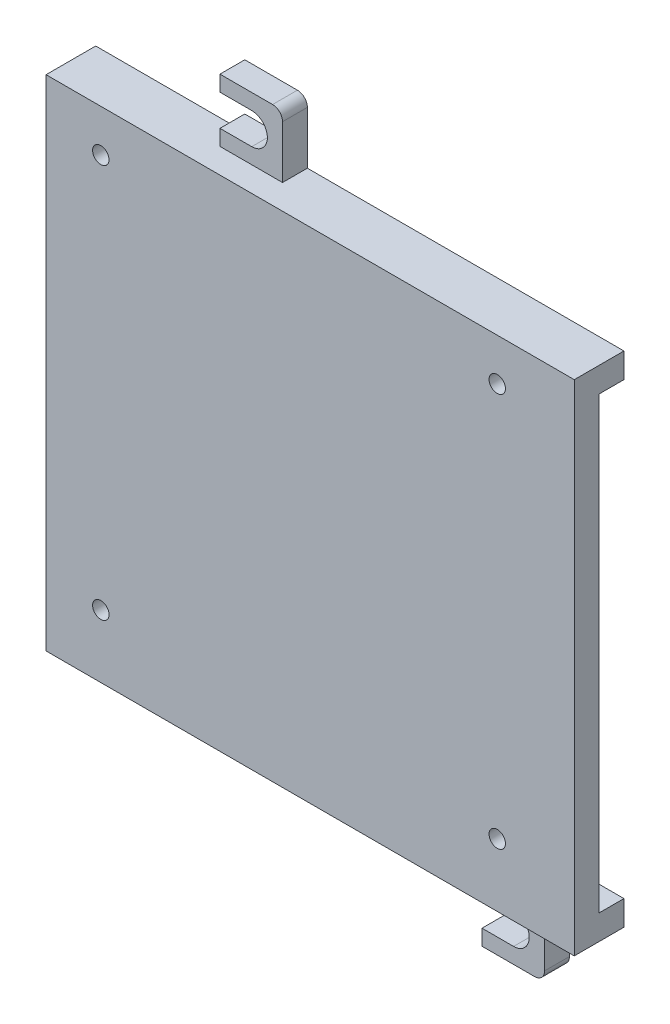
ISO-10303-21;
HEADER;
FILE_DESCRIPTION(('STEP AP214'),'2;1');
FILE_NAME('part.step','',(''),(''),'','','');
FILE_SCHEMA(('AUTOMOTIVE_DESIGN { 1 0 10303 214 1 1 1 1 }'));
ENDSEC;
DATA;
#1=APPLICATION_CONTEXT('core data for automotive mechanical design processes');
#2=APPLICATION_PROTOCOL_DEFINITION('international standard','automotive_design',2000,#1);
#3=PRODUCT_CONTEXT('',#1,'mechanical');
#4=PRODUCT('Part','Part','',(#3));
#5=PRODUCT_RELATED_PRODUCT_CATEGORY('part','',(#4));
#6=PRODUCT_DEFINITION_FORMATION('','',#4);
#7=PRODUCT_DEFINITION_CONTEXT('part definition',#1,'design');
#8=PRODUCT_DEFINITION('design','',#6,#7);
#9=PRODUCT_DEFINITION_SHAPE('','',#8);
#10=(LENGTH_UNIT() NAMED_UNIT(*) SI_UNIT(.MILLI.,.METRE.));
#11=(NAMED_UNIT(*) PLANE_ANGLE_UNIT() SI_UNIT($,.RADIAN.));
#12=(NAMED_UNIT(*) SI_UNIT($,.STERADIAN.) SOLID_ANGLE_UNIT());
#13=UNCERTAINTY_MEASURE_WITH_UNIT(LENGTH_MEASURE(1.E-05),#10,'distance_accuracy_value','');
#14=(GEOMETRIC_REPRESENTATION_CONTEXT(3) GLOBAL_UNCERTAINTY_ASSIGNED_CONTEXT((#13)) GLOBAL_UNIT_ASSIGNED_CONTEXT((#10,
#11,#12)) REPRESENTATION_CONTEXT('',''));
#15=CARTESIAN_POINT('',(0.,0.,0.));
#16=DIRECTION('',(0.,0.,1.));
#17=DIRECTION('',(1.,0.,0.));
#18=AXIS2_PLACEMENT_3D('',#15,#16,#17);
#19=CARTESIAN_POINT('',(0.,-11.5232891046381,-64.8744476194032));
#20=DIRECTION('',(0.,-1.,0.));
#21=DIRECTION('',(0.,0.,-1.));
#22=AXIS2_PLACEMENT_3D('',#19,#20,#21);
#23=PLANE('',#22);
#24=DIRECTION('',(0.,0.,-1.));
#25=VECTOR('',#24,1.);
#26=CARTESIAN_POINT('',(118.238104548264,-11.5232891046381,-71.2244476194032));
#27=LINE('',#26,#25);
#28=CARTESIAN_POINT('',(118.238104548264,-11.5232891046381,-71.2244476194032));
#29=VERTEX_POINT('',#28);
#30=CARTESIAN_POINT('',(118.238104548264,-11.5232891046381,-77.5744476194032));
#31=VERTEX_POINT('',#30);
#32=EDGE_CURVE('E324',#29,#31,#27,.T.);
#33=ORIENTED_EDGE('',*,*,#32,.F.);
#34=DIRECTION('',(-1.,0.,0.));
#35=VECTOR('',#34,1.);
#36=CARTESIAN_POINT('',(0.,-11.5232891046381,-71.2244476194032));
#37=LINE('',#36,#35);
#38=CARTESIAN_POINT('',(102.238104548264,-11.5232891046381,-71.2244476194032));
#39=VERTEX_POINT('',#38);
#40=EDGE_CURVE('E293',#29,#39,#37,.T.);
#41=ORIENTED_EDGE('',*,*,#40,.T.);
#42=DIRECTION('',(0.,0.,-1.));
#43=VECTOR('',#42,1.);
#44=CARTESIAN_POINT('',(102.238104548264,-11.5232891046381,-71.2244476194032));
#45=LINE('',#44,#43);
#46=CARTESIAN_POINT('',(102.238104548264,-11.5232891046381,-77.5744476194032));
#47=VERTEX_POINT('',#46);
#48=EDGE_CURVE('E321',#39,#47,#45,.T.);
#49=ORIENTED_EDGE('',*,*,#48,.T.);
#50=DIRECTION('',(-1.,0.,0.));
#51=VECTOR('',#50,1.);
#52=CARTESIAN_POINT('',(0.,-11.5232891046381,-77.5744476194032));
#53=LINE('',#52,#51);
#54=CARTESIAN_POINT('',(64.1381045482638,-11.5232891046381,-77.5744476194032));
#55=VERTEX_POINT('',#54);
#56=EDGE_CURVE('E334',#47,#55,#53,.T.);
#57=ORIENTED_EDGE('',*,*,#56,.T.);
#58=DIRECTION('',(0.,0.,-1.));
#59=VECTOR('',#58,1.);
#60=CARTESIAN_POINT('',(64.1381045482638,-11.5232891046381,-64.8744476194032));
#61=LINE('',#60,#59);
#62=CARTESIAN_POINT('',(64.1381045482638,-11.5232891046381,-64.8744476194032));
#63=VERTEX_POINT('',#62);
#64=EDGE_CURVE('E347',#63,#55,#61,.T.);
#65=ORIENTED_EDGE('',*,*,#64,.F.);
#66=DIRECTION('',(-1.,0.,0.));
#67=VECTOR('',#66,1.);
#68=CARTESIAN_POINT('',(0.,-11.5232891046381,-64.8744476194032));
#69=LINE('',#68,#67);
#70=CARTESIAN_POINT('',(199.169520932819,-11.5232891046381,-64.8744476194032));
#71=VERTEX_POINT('',#70);
#72=EDGE_CURVE('E344',#71,#63,#69,.T.);
#73=ORIENTED_EDGE('',*,*,#72,.F.);
#74=DIRECTION('',(0.,0.,-1.));
#75=VECTOR('',#74,1.);
#76=CARTESIAN_POINT('',(199.169520932819,-11.5232891046381,-64.8744476194032));
#77=LINE('',#76,#75);
#78=CARTESIAN_POINT('',(199.169520932819,-11.5232891046381,-77.5744476194032));
#79=VERTEX_POINT('',#78);
#80=EDGE_CURVE('E353',#71,#79,#77,.T.);
#81=ORIENTED_EDGE('',*,*,#80,.T.);
#82=EDGE_CURVE('E335',#79,#31,#53,.T.);
#83=ORIENTED_EDGE('',*,*,#82,.T.);
#84=EDGE_LOOP('',(#33,#41,#49,#57,#65,#73,#81,#83));
#85=FACE_BOUND('',#84,.T.);
#86=ADVANCED_FACE('F43',(#85),#23,.F.);
#87=CARTESIAN_POINT('',(64.1381045482638,0.,-71.2244476194032));
#88=DIRECTION('',(-1.,0.,0.));
#89=DIRECTION('',(0.,0.,1.));
#90=AXIS2_PLACEMENT_3D('',#87,#88,#89);
#91=PLANE('',#90);
#92=DIRECTION('',(0.,-1.,0.));
#93=VECTOR('',#92,1.);
#94=CARTESIAN_POINT('',(64.1381045482638,0.,-64.8744476194032));
#95=LINE('',#94,#93);
#96=CARTESIAN_POINT('',(64.1381045482638,-139.102289104638,-64.8744476194032));
#97=VERTEX_POINT('',#96);
#98=EDGE_CURVE('E419',#63,#97,#95,.T.);
#99=ORIENTED_EDGE('',*,*,#98,.F.);
#100=ORIENTED_EDGE('',*,*,#64,.T.);
#101=DIRECTION('',(0.,-1.,0.));
#102=VECTOR('',#101,1.);
#103=CARTESIAN_POINT('',(64.1381045482638,0.,-77.5744476194032));
#104=LINE('',#103,#102);
#105=CARTESIAN_POINT('',(64.1381045482638,-17.8732891046381,-77.5744476194032));
#106=VERTEX_POINT('',#105);
#107=EDGE_CURVE('E317',#55,#106,#104,.T.);
#108=ORIENTED_EDGE('',*,*,#107,.T.);
#109=DIRECTION('',(0.,0.,-1.));
#110=VECTOR('',#109,1.);
#111=CARTESIAN_POINT('',(64.1381045482638,-17.8732891046381,-64.8744476194032));
#112=LINE('',#111,#110);
#113=CARTESIAN_POINT('',(64.1381045482638,-17.8732891046381,-71.2244476194032));
#114=VERTEX_POINT('',#113);
#115=EDGE_CURVE('E348',#114,#106,#112,.T.);
#116=ORIENTED_EDGE('',*,*,#115,.F.);
#117=DIRECTION('',(0.,-1.,0.));
#118=VECTOR('',#117,1.);
#119=CARTESIAN_POINT('',(64.1381045482638,0.,-71.2244476194032));
#120=LINE('',#119,#118);
#121=CARTESIAN_POINT('',(64.1381045482638,-132.752289104638,-71.2244476194032));
#122=VERTEX_POINT('',#121);
#123=EDGE_CURVE('E395',#114,#122,#120,.T.);
#124=ORIENTED_EDGE('',*,*,#123,.T.);
#125=DIRECTION('',(0.,0.,-1.));
#126=VECTOR('',#125,1.);
#127=CARTESIAN_POINT('',(64.1381045482638,-132.752289104638,-64.8744476194032));
#128=LINE('',#127,#126);
#129=CARTESIAN_POINT('',(64.1381045482638,-132.752289104638,-77.5744476194032));
#130=VERTEX_POINT('',#129);
#131=EDGE_CURVE('E378',#122,#130,#128,.T.);
#132=ORIENTED_EDGE('',*,*,#131,.T.);
#133=DIRECTION('',(0.,1.,0.));
#134=VECTOR('',#133,1.);
#135=CARTESIAN_POINT('',(64.1381045482638,0.,-77.5744476194032));
#136=LINE('',#135,#134);
#137=CARTESIAN_POINT('',(64.1381045482638,-139.102289104638,-77.5744476194032));
#138=VERTEX_POINT('',#137);
#139=EDGE_CURVE('E360',#138,#130,#136,.T.);
#140=ORIENTED_EDGE('',*,*,#139,.F.);
#141=DIRECTION('',(0.,0.,-1.));
#142=VECTOR('',#141,1.);
#143=CARTESIAN_POINT('',(64.1381045482638,-139.102289104638,-64.8744476194032));
#144=LINE('',#143,#142);
#145=EDGE_CURVE('E372',#97,#138,#144,.T.);
#146=ORIENTED_EDGE('',*,*,#145,.F.);
#147=EDGE_LOOP('',(#99,#100,#108,#116,#124,#132,#140,#146));
#148=FACE_BOUND('',#147,.T.);
#149=ADVANCED_FACE('F458',(#148),#91,.T.);
#150=CARTESIAN_POINT('',(199.169520932819,0.,-71.2244476194032));
#151=DIRECTION('',(-1.,0.,0.));
#152=DIRECTION('',(0.,0.,1.));
#153=AXIS2_PLACEMENT_3D('',#150,#151,#152);
#154=PLANE('',#153);
#155=DIRECTION('',(0.,-1.,0.));
#156=VECTOR('',#155,1.);
#157=CARTESIAN_POINT('',(199.169520932819,0.,-64.8744476194032));
#158=LINE('',#157,#156);
#159=CARTESIAN_POINT('',(199.169520932819,-139.102289104638,-64.8744476194032));
#160=VERTEX_POINT('',#159);
#161=EDGE_CURVE('E386',#71,#160,#158,.T.);
#162=ORIENTED_EDGE('',*,*,#161,.T.);
#163=DIRECTION('',(0.,0.,-1.));
#164=VECTOR('',#163,1.);
#165=CARTESIAN_POINT('',(199.169520932819,-139.102289104638,-64.8744476194032));
#166=LINE('',#165,#164);
#167=CARTESIAN_POINT('',(199.169520932819,-139.102289104638,-77.5744476194032));
#168=VERTEX_POINT('',#167);
#169=EDGE_CURVE('E373',#160,#168,#166,.T.);
#170=ORIENTED_EDGE('',*,*,#169,.T.);
#171=DIRECTION('',(0.,-1.,0.));
#172=VECTOR('',#171,1.);
#173=CARTESIAN_POINT('',(199.169520932819,0.,-77.5744476194032));
#174=LINE('',#173,#172);
#175=CARTESIAN_POINT('',(199.169520932819,-132.752289104638,-77.5744476194032));
#176=VERTEX_POINT('',#175);
#177=EDGE_CURVE('E366',#176,#168,#174,.T.);
#178=ORIENTED_EDGE('',*,*,#177,.F.);
#179=DIRECTION('',(0.,0.,-1.));
#180=VECTOR('',#179,1.);
#181=CARTESIAN_POINT('',(199.169520932819,-132.752289104638,-64.8744476194032));
#182=LINE('',#181,#180);
#183=CARTESIAN_POINT('',(199.169520932819,-132.752289104638,-71.2244476194032));
#184=VERTEX_POINT('',#183);
#185=EDGE_CURVE('E376',#184,#176,#182,.T.);
#186=ORIENTED_EDGE('',*,*,#185,.F.);
#187=DIRECTION('',(0.,-1.,0.));
#188=VECTOR('',#187,1.);
#189=CARTESIAN_POINT('',(199.169520932819,0.,-71.2244476194032));
#190=LINE('',#189,#188);
#191=CARTESIAN_POINT('',(199.169520932819,-17.8732891046381,-71.2244476194032));
#192=VERTEX_POINT('',#191);
#193=EDGE_CURVE('E401',#192,#184,#190,.T.);
#194=ORIENTED_EDGE('',*,*,#193,.F.);
#195=DIRECTION('',(0.,0.,-1.));
#196=VECTOR('',#195,1.);
#197=CARTESIAN_POINT('',(199.169520932819,-17.8732891046381,-64.8744476194032));
#198=LINE('',#197,#196);
#199=CARTESIAN_POINT('',(199.169520932819,-17.8732891046381,-77.5744476194032));
#200=VERTEX_POINT('',#199);
#201=EDGE_CURVE('E351',#192,#200,#198,.T.);
#202=ORIENTED_EDGE('',*,*,#201,.T.);
#203=DIRECTION('',(0.,-1.,0.));
#204=VECTOR('',#203,1.);
#205=CARTESIAN_POINT('',(199.169520932819,0.,-77.5744476194032));
#206=LINE('',#205,#204);
#207=EDGE_CURVE('E338',#79,#200,#206,.T.);
#208=ORIENTED_EDGE('',*,*,#207,.F.);
#209=ORIENTED_EDGE('',*,*,#80,.F.);
#210=EDGE_LOOP('',(#162,#170,#178,#186,#194,#202,#208,#209));
#211=FACE_BOUND('',#210,.T.);
#212=ADVANCED_FACE('F466',(#211),#154,.F.);
#213=CARTESIAN_POINT('',(179.484520932819,-22.3182891046381,-71.2244476194032));
#214=DIRECTION('',(0.,0.,1.));
#215=DIRECTION('',(1.,0.,0.));
#216=AXIS2_PLACEMENT_3D('',#213,#214,#215);
#217=CYLINDRICAL_SURFACE('',#216,2.09999999999999);
#218=CARTESIAN_POINT('',(179.484520932819,-22.3182891046381,-71.2244476194032));
#219=DIRECTION('',(0.,0.,-1.));
#220=DIRECTION('',(-1.,0.,0.));
#221=AXIS2_PLACEMENT_3D('',#218,#219,#220);
#222=CIRCLE('',#221,2.09999999999999);
#223=CARTESIAN_POINT('',(177.384520932819,-22.3182891046381,-71.2244476194032));
#224=VERTEX_POINT('',#223);
#225=EDGE_CURVE('E392',#224,#224,#222,.T.);
#226=ORIENTED_EDGE('',*,*,#225,.T.);
#227=EDGE_LOOP('',(#226));
#228=FACE_BOUND('',#227,.T.);
#229=CARTESIAN_POINT('',(179.484520932819,-22.3182891046381,-64.8744476194032));
#230=DIRECTION('',(0.,0.,-1.));
#231=DIRECTION('',(-1.,0.,0.));
#232=AXIS2_PLACEMENT_3D('',#229,#230,#231);
#233=CIRCLE('',#232,2.09999999999999);
#234=CARTESIAN_POINT('',(177.384520932819,-22.3182891046381,-64.8744476194032));
#235=VERTEX_POINT('',#234);
#236=EDGE_CURVE('E416',#235,#235,#233,.T.);
#237=ORIENTED_EDGE('',*,*,#236,.F.);
#238=EDGE_LOOP('',(#237));
#239=FACE_BOUND('',#238,.T.);
#240=ADVANCED_FACE('F491',(#228,#239),#217,.F.);
#241=CARTESIAN_POINT('',(78.1385209328186,-22.3182891046381,-71.2244476194032));
#242=DIRECTION('',(0.,0.,1.));
#243=DIRECTION('',(1.,0.,0.));
#244=AXIS2_PLACEMENT_3D('',#241,#242,#243);
#245=CYLINDRICAL_SURFACE('',#244,2.1);
#246=CARTESIAN_POINT('',(78.1385209328186,-22.3182891046381,-71.2244476194032));
#247=DIRECTION('',(0.,0.,-1.));
#248=DIRECTION('',(-1.,0.,0.));
#249=AXIS2_PLACEMENT_3D('',#246,#247,#248);
#250=CIRCLE('',#249,2.1);
#251=CARTESIAN_POINT('',(76.0385209328186,-22.3182891046381,-71.2244476194032));
#252=VERTEX_POINT('',#251);
#253=EDGE_CURVE('E389',#252,#252,#250,.T.);
#254=ORIENTED_EDGE('',*,*,#253,.T.);
#255=EDGE_LOOP('',(#254));
#256=FACE_BOUND('',#255,.T.);
#257=CARTESIAN_POINT('',(78.1385209328186,-22.3182891046381,-64.8744476194032));
#258=DIRECTION('',(0.,0.,-1.));
#259=DIRECTION('',(-1.,0.,0.));
#260=AXIS2_PLACEMENT_3D('',#257,#258,#259);
#261=CIRCLE('',#260,2.1);
#262=CARTESIAN_POINT('',(76.0385209328186,-22.3182891046381,-64.8744476194032));
#263=VERTEX_POINT('',#262);
#264=EDGE_CURVE('E413',#263,#263,#261,.T.);
#265=ORIENTED_EDGE('',*,*,#264,.F.);
#266=EDGE_LOOP('',(#265));
#267=FACE_BOUND('',#266,.T.);
#268=ADVANCED_FACE('F496',(#256,#267),#245,.F.);
#269=CARTESIAN_POINT('',(78.1385209328186,-123.029289104638,-71.2244476194032));
#270=DIRECTION('',(0.,0.,1.));
#271=DIRECTION('',(1.,0.,0.));
#272=AXIS2_PLACEMENT_3D('',#269,#270,#271);
#273=CYLINDRICAL_SURFACE('',#272,2.1);
#274=CARTESIAN_POINT('',(78.1385209328186,-123.029289104638,-71.2244476194032));
#275=DIRECTION('',(0.,0.,-1.));
#276=DIRECTION('',(-1.,0.,0.));
#277=AXIS2_PLACEMENT_3D('',#274,#275,#276);
#278=CIRCLE('',#277,2.1);
#279=CARTESIAN_POINT('',(76.0385209328186,-123.029289104638,-71.2244476194032));
#280=VERTEX_POINT('',#279);
#281=EDGE_CURVE('E385',#280,#280,#278,.T.);
#282=ORIENTED_EDGE('',*,*,#281,.T.);
#283=EDGE_LOOP('',(#282));
#284=FACE_BOUND('',#283,.T.);
#285=CARTESIAN_POINT('',(78.1385209328186,-123.029289104638,-64.8744476194032));
#286=DIRECTION('',(0.,0.,-1.));
#287=DIRECTION('',(-1.,0.,0.));
#288=AXIS2_PLACEMENT_3D('',#285,#286,#287);
#289=CIRCLE('',#288,2.1);
#290=CARTESIAN_POINT('',(76.0385209328186,-123.029289104638,-64.8744476194032));
#291=VERTEX_POINT('',#290);
#292=EDGE_CURVE('E410',#291,#291,#289,.T.);
#293=ORIENTED_EDGE('',*,*,#292,.F.);
#294=EDGE_LOOP('',(#293));
#295=FACE_BOUND('',#294,.T.);
#296=ADVANCED_FACE('F500',(#284,#295),#273,.F.);
#297=CARTESIAN_POINT('',(179.484520932819,-123.029289104638,-71.2244476194032));
#298=DIRECTION('',(0.,0.,1.));
#299=DIRECTION('',(1.,0.,0.));
#300=AXIS2_PLACEMENT_3D('',#297,#298,#299);
#301=CYLINDRICAL_SURFACE('',#300,2.09999999999999);
#302=CARTESIAN_POINT('',(179.484520932819,-123.029289104638,-71.2244476194032));
#303=DIRECTION('',(0.,0.,-1.));
#304=DIRECTION('',(-1.,0.,0.));
#305=AXIS2_PLACEMENT_3D('',#302,#303,#304);
#306=CIRCLE('',#305,2.09999999999999);
#307=CARTESIAN_POINT('',(177.384520932819,-123.029289104638,-71.2244476194032));
#308=VERTEX_POINT('',#307);
#309=EDGE_CURVE('E382',#308,#308,#306,.T.);
#310=ORIENTED_EDGE('',*,*,#309,.T.);
#311=EDGE_LOOP('',(#310));
#312=FACE_BOUND('',#311,.T.);
#313=CARTESIAN_POINT('',(179.484520932819,-123.029289104638,-64.8744476194032));
#314=DIRECTION('',(0.,0.,-1.));
#315=DIRECTION('',(-1.,0.,0.));
#316=AXIS2_PLACEMENT_3D('',#313,#314,#315);
#317=CIRCLE('',#316,2.09999999999999);
#318=CARTESIAN_POINT('',(177.384520932819,-123.029289104638,-64.8744476194032));
#319=VERTEX_POINT('',#318);
#320=EDGE_CURVE('E375',#319,#319,#317,.T.);
#321=ORIENTED_EDGE('',*,*,#320,.F.);
#322=EDGE_LOOP('',(#321));
#323=FACE_BOUND('',#322,.T.);
#324=ADVANCED_FACE('F485',(#312,#323),#301,.F.);
#325=CARTESIAN_POINT('',(0.,0.,-71.2244476194032));
#326=DIRECTION('',(0.,0.,-1.));
#327=DIRECTION('',(-1.,0.,0.));
#328=AXIS2_PLACEMENT_3D('',#325,#326,#327);
#329=PLANE('',#328);
#330=ORIENTED_EDGE('',*,*,#309,.F.);
#331=EDGE_LOOP('',(#330));
#332=FACE_BOUND('',#331,.T.);
#333=ORIENTED_EDGE('',*,*,#281,.F.);
#334=EDGE_LOOP('',(#333));
#335=FACE_BOUND('',#334,.T.);
#336=ORIENTED_EDGE('',*,*,#253,.F.);
#337=EDGE_LOOP('',(#336));
#338=FACE_BOUND('',#337,.T.);
#339=ORIENTED_EDGE('',*,*,#225,.F.);
#340=EDGE_LOOP('',(#339));
#341=FACE_BOUND('',#340,.T.);
#342=ORIENTED_EDGE('',*,*,#123,.F.);
#343=DIRECTION('',(-1.,0.,0.));
#344=VECTOR('',#343,1.);
#345=CARTESIAN_POINT('',(0.,-17.8732891046381,-71.2244476194032));
#346=LINE('',#345,#344);
#347=EDGE_CURVE('E398',#192,#114,#346,.T.);
#348=ORIENTED_EDGE('',*,*,#347,.F.);
#349=ORIENTED_EDGE('',*,*,#193,.T.);
#350=DIRECTION('',(-1.,0.,0.));
#351=VECTOR('',#350,1.);
#352=CARTESIAN_POINT('',(0.,-132.752289104638,-71.2244476194032));
#353=LINE('',#352,#351);
#354=EDGE_CURVE('E404',#184,#122,#353,.T.);
#355=ORIENTED_EDGE('',*,*,#354,.T.);
#356=EDGE_LOOP('',(#342,#348,#349,#355));
#357=FACE_BOUND('',#356,.T.);
#358=ADVANCED_FACE('F482',(#332,#335,#338,#341,#357),#329,.T.);
#359=CARTESIAN_POINT('',(0.,0.,-64.8744476194032));
#360=DIRECTION('',(0.,0.,-1.));
#361=DIRECTION('',(-1.,0.,0.));
#362=AXIS2_PLACEMENT_3D('',#359,#360,#361);
#363=PLANE('',#362);
#364=ORIENTED_EDGE('',*,*,#320,.T.);
#365=EDGE_LOOP('',(#364));
#366=FACE_BOUND('',#365,.T.);
#367=ORIENTED_EDGE('',*,*,#292,.T.);
#368=EDGE_LOOP('',(#367));
#369=FACE_BOUND('',#368,.T.);
#370=ORIENTED_EDGE('',*,*,#264,.T.);
#371=EDGE_LOOP('',(#370));
#372=FACE_BOUND('',#371,.T.);
#373=ORIENTED_EDGE('',*,*,#236,.T.);
#374=EDGE_LOOP('',(#373));
#375=FACE_BOUND('',#374,.T.);
#376=ORIENTED_EDGE('',*,*,#98,.T.);
#377=DIRECTION('',(-1.,0.,0.));
#378=VECTOR('',#377,1.);
#379=CARTESIAN_POINT('',(0.,-139.102289104638,-64.8744476194032));
#380=LINE('',#379,#378);
#381=EDGE_CURVE('E369',#160,#97,#380,.T.);
#382=ORIENTED_EDGE('',*,*,#381,.F.);
#383=ORIENTED_EDGE('',*,*,#161,.F.);
#384=ORIENTED_EDGE('',*,*,#72,.T.);
#385=EDGE_LOOP('',(#376,#382,#383,#384));
#386=FACE_BOUND('',#385,.T.);
#387=ADVANCED_FACE('F481',(#366,#369,#372,#375,#386),#363,.F.);
#388=CARTESIAN_POINT('',(0.,-139.102289104638,-64.8744476194032));
#389=DIRECTION('',(0.,-1.,0.));
#390=DIRECTION('',(0.,0.,-1.));
#391=AXIS2_PLACEMENT_3D('',#388,#389,#390);
#392=PLANE('',#391);
#393=DIRECTION('',(0.,0.,-1.));
#394=VECTOR('',#393,1.);
#395=CARTESIAN_POINT('',(169.234768940489,-139.102289104638,-71.2244476194032));
#396=LINE('',#395,#394);
#397=CARTESIAN_POINT('',(169.234768940489,-139.102289104638,-71.2244476194032));
#398=VERTEX_POINT('',#397);
#399=CARTESIAN_POINT('',(169.234768940489,-139.102289104638,-77.5744476194032));
#400=VERTEX_POINT('',#399);
#401=EDGE_CURVE('E275',#398,#400,#396,.T.);
#402=ORIENTED_EDGE('',*,*,#401,.F.);
#403=DIRECTION('',(-1.,0.,0.));
#404=VECTOR('',#403,1.);
#405=CARTESIAN_POINT('',(-2.41304006471928E-13,-139.102289104638,-71.2244476194032));
#406=LINE('',#405,#404);
#407=CARTESIAN_POINT('',(185.234768940489,-139.102289104638,-71.2244476194032));
#408=VERTEX_POINT('',#407);
#409=EDGE_CURVE('E241',#408,#398,#406,.T.);
#410=ORIENTED_EDGE('',*,*,#409,.F.);
#411=DIRECTION('',(0.,0.,-1.));
#412=VECTOR('',#411,1.);
#413=CARTESIAN_POINT('',(185.234768940489,-139.102289104638,-71.2244476194032));
#414=LINE('',#413,#412);
#415=CARTESIAN_POINT('',(185.234768940489,-139.102289104638,-77.5744476194032));
#416=VERTEX_POINT('',#415);
#417=EDGE_CURVE('E272',#408,#416,#414,.T.);
#418=ORIENTED_EDGE('',*,*,#417,.T.);
#419=DIRECTION('',(-1.,0.,0.));
#420=VECTOR('',#419,1.);
#421=CARTESIAN_POINT('',(0.,-139.102289104638,-77.5744476194032));
#422=LINE('',#421,#420);
#423=EDGE_CURVE('E357',#168,#416,#422,.T.);
#424=ORIENTED_EDGE('',*,*,#423,.F.);
#425=ORIENTED_EDGE('',*,*,#169,.F.);
#426=ORIENTED_EDGE('',*,*,#381,.T.);
#427=ORIENTED_EDGE('',*,*,#145,.T.);
#428=EDGE_CURVE('E350',#400,#138,#422,.T.);
#429=ORIENTED_EDGE('',*,*,#428,.F.);
#430=EDGE_LOOP('',(#402,#410,#418,#424,#425,#426,#427,#429));
#431=FACE_BOUND('',#430,.T.);
#432=ADVANCED_FACE('F446',(#431),#392,.T.);
#433=CARTESIAN_POINT('',(0.,-132.752289104638,-64.8744476194032));
#434=DIRECTION('',(0.,-1.,0.));
#435=DIRECTION('',(0.,0.,-1.));
#436=AXIS2_PLACEMENT_3D('',#433,#434,#435);
#437=PLANE('',#436);
#438=ORIENTED_EDGE('',*,*,#354,.F.);
#439=ORIENTED_EDGE('',*,*,#185,.T.);
#440=DIRECTION('',(-1.,0.,0.));
#441=VECTOR('',#440,1.);
#442=CARTESIAN_POINT('',(0.,-132.752289104638,-77.5744476194032));
#443=LINE('',#442,#441);
#444=EDGE_CURVE('E363',#176,#130,#443,.T.);
#445=ORIENTED_EDGE('',*,*,#444,.T.);
#446=ORIENTED_EDGE('',*,*,#131,.F.);
#447=EDGE_LOOP('',(#438,#439,#445,#446));
#448=FACE_BOUND('',#447,.T.);
#449=ADVANCED_FACE('F476',(#448),#437,.F.);
#450=CARTESIAN_POINT('',(0.,0.,-77.5744476194032));
#451=DIRECTION('',(0.,0.,-1.));
#452=DIRECTION('',(-1.,0.,0.));
#453=AXIS2_PLACEMENT_3D('',#450,#451,#452);
#454=PLANE('',#453);
#455=DIRECTION('',(0.,-1.,0.));
#456=VECTOR('',#455,1.);
#457=CARTESIAN_POINT('',(185.234768940489,0.,-77.5744476194032));
#458=LINE('',#457,#456);
#459=CARTESIAN_POINT('',(185.234768940489,-152.562289104638,-77.5744476194032));
#460=VERTEX_POINT('',#459);
#461=EDGE_CURVE('E258',#416,#460,#458,.T.);
#462=ORIENTED_EDGE('',*,*,#461,.T.);
#463=CARTESIAN_POINT('',(182.694768940489,-152.562289104638,-77.5744476194032));
#464=DIRECTION('',(0.,0.,-1.));
#465=DIRECTION('',(-1.,0.,0.));
#466=AXIS2_PLACEMENT_3D('',#463,#464,#465);
#467=CIRCLE('',#466,2.54);
#468=CARTESIAN_POINT('',(182.694768940489,-155.102289104638,-77.5744476194032));
#469=VERTEX_POINT('',#468);
#470=EDGE_CURVE('E65',#460,#469,#467,.T.);
#471=ORIENTED_EDGE('',*,*,#470,.T.);
#472=DIRECTION('',(-1.,0.,0.));
#473=VECTOR('',#472,1.);
#474=CARTESIAN_POINT('',(0.,-155.102289104638,-77.5744476194032));
#475=LINE('',#474,#473);
#476=CARTESIAN_POINT('',(169.234768940489,-155.102289104638,-77.5744476194032));
#477=VERTEX_POINT('',#476);
#478=EDGE_CURVE('E261',#469,#477,#475,.T.);
#479=ORIENTED_EDGE('',*,*,#478,.T.);
#480=DIRECTION('',(0.,1.,0.));
#481=VECTOR('',#480,1.);
#482=CARTESIAN_POINT('',(169.234768940489,0.,-77.5744476194032));
#483=LINE('',#482,#481);
#484=CARTESIAN_POINT('',(169.234768940489,-151.102289104638,-77.5744476194032));
#485=VERTEX_POINT('',#484);
#486=EDGE_CURVE('E259',#477,#485,#483,.T.);
#487=ORIENTED_EDGE('',*,*,#486,.T.);
#488=DIRECTION('',(-1.,0.,0.));
#489=VECTOR('',#488,1.);
#490=CARTESIAN_POINT('',(0.,-151.102289104638,-77.5744476194032));
#491=LINE('',#490,#489);
#492=CARTESIAN_POINT('',(177.309968940489,-151.102289104638,-77.5744476194032));
#493=VERTEX_POINT('',#492);
#494=EDGE_CURVE('E234',#493,#485,#491,.T.);
#495=ORIENTED_EDGE('',*,*,#494,.F.);
#496=CARTESIAN_POINT('',(177.309968940489,-147.102289104638,-77.5744476194032));
#497=DIRECTION('',(0.,0.,-1.));
#498=DIRECTION('',(-1.,0.,0.));
#499=AXIS2_PLACEMENT_3D('',#496,#497,#498);
#500=CIRCLE('',#499,4.);
#501=CARTESIAN_POINT('',(177.309968940489,-143.102289104638,-77.5744476194032));
#502=VERTEX_POINT('',#501);
#503=EDGE_CURVE('E252',#502,#493,#500,.T.);
#504=ORIENTED_EDGE('',*,*,#503,.F.);
#505=DIRECTION('',(-1.,0.,0.));
#506=VECTOR('',#505,1.);
#507=CARTESIAN_POINT('',(0.,-143.102289104638,-77.5744476194032));
#508=LINE('',#507,#506);
#509=CARTESIAN_POINT('',(169.234768940489,-143.102289104638,-77.5744476194032));
#510=VERTEX_POINT('',#509);
#511=EDGE_CURVE('E220',#502,#510,#508,.T.);
#512=ORIENTED_EDGE('',*,*,#511,.T.);
#513=EDGE_CURVE('E255',#510,#400,#483,.T.);
#514=ORIENTED_EDGE('',*,*,#513,.T.);
#515=ORIENTED_EDGE('',*,*,#428,.T.);
#516=ORIENTED_EDGE('',*,*,#139,.T.);
#517=ORIENTED_EDGE('',*,*,#444,.F.);
#518=ORIENTED_EDGE('',*,*,#177,.T.);
#519=ORIENTED_EDGE('',*,*,#423,.T.);
#520=EDGE_LOOP('',(#462,#471,#479,#487,#495,#504,#512,#514,#515,#516,#517,#518,#519));
#521=FACE_BOUND('',#520,.T.);
#522=ADVANCED_FACE('F439',(#521),#454,.T.);
#523=CARTESIAN_POINT('',(0.,-17.8732891046381,-64.8744476194032));
#524=DIRECTION('',(0.,1.,0.));
#525=DIRECTION('',(0.,0.,1.));
#526=AXIS2_PLACEMENT_3D('',#523,#524,#525);
#527=PLANE('',#526);
#528=ORIENTED_EDGE('',*,*,#201,.F.);
#529=ORIENTED_EDGE('',*,*,#347,.T.);
#530=ORIENTED_EDGE('',*,*,#115,.T.);
#531=DIRECTION('',(1.,0.,0.));
#532=VECTOR('',#531,1.);
#533=CARTESIAN_POINT('',(0.,-17.8732891046381,-77.5744476194032));
#534=LINE('',#533,#532);
#535=EDGE_CURVE('E341',#106,#200,#534,.T.);
#536=ORIENTED_EDGE('',*,*,#535,.T.);
#537=EDGE_LOOP('',(#528,#529,#530,#536));
#538=FACE_BOUND('',#537,.T.);
#539=ADVANCED_FACE('F472',(#538),#527,.F.);
#540=CARTESIAN_POINT('',(0.,0.,-77.5744476194032));
#541=DIRECTION('',(0.,0.,-1.));
#542=DIRECTION('',(-1.,0.,0.));
#543=AXIS2_PLACEMENT_3D('',#540,#541,#542);
#544=PLANE('',#543);
#545=DIRECTION('',(-1.,0.,0.));
#546=VECTOR('',#545,1.);
#547=CARTESIAN_POINT('',(0.,4.47671089536188,-77.5744476194032));
#548=LINE('',#547,#546);
#549=CARTESIAN_POINT('',(115.698104548264,4.47671089536188,-77.5744476194032));
#550=VERTEX_POINT('',#549);
#551=CARTESIAN_POINT('',(102.238104548264,4.47671089536188,-77.5744476194032));
#552=VERTEX_POINT('',#551);
#553=EDGE_CURVE('E307',#550,#552,#548,.T.);
#554=ORIENTED_EDGE('',*,*,#553,.F.);
#555=CARTESIAN_POINT('',(115.698104548264,1.93671089536188,-77.5744476194032));
#556=DIRECTION('',(0.,0.,-1.));
#557=DIRECTION('',(-1.,0.,0.));
#558=AXIS2_PLACEMENT_3D('',#555,#556,#557);
#559=CIRCLE('',#558,2.54);
#560=CARTESIAN_POINT('',(118.238104548264,1.93671089536188,-77.5744476194032));
#561=VERTEX_POINT('',#560);
#562=EDGE_CURVE('E424',#550,#561,#559,.T.);
#563=ORIENTED_EDGE('',*,*,#562,.T.);
#564=DIRECTION('',(0.,1.,0.));
#565=VECTOR('',#564,1.);
#566=CARTESIAN_POINT('',(118.238104548264,0.,-77.5744476194032));
#567=LINE('',#566,#565);
#568=EDGE_CURVE('E310',#31,#561,#567,.T.);
#569=ORIENTED_EDGE('',*,*,#568,.F.);
#570=ORIENTED_EDGE('',*,*,#82,.F.);
#571=ORIENTED_EDGE('',*,*,#207,.T.);
#572=ORIENTED_EDGE('',*,*,#535,.F.);
#573=ORIENTED_EDGE('',*,*,#107,.F.);
#574=ORIENTED_EDGE('',*,*,#56,.F.);
#575=DIRECTION('',(0.,-1.,0.));
#576=VECTOR('',#575,1.);
#577=CARTESIAN_POINT('',(102.238104548264,0.,-77.5744476194032));
#578=LINE('',#577,#576);
#579=CARTESIAN_POINT('',(102.238104548264,-7.52328910463812,-77.5744476194032));
#580=VERTEX_POINT('',#579);
#581=EDGE_CURVE('E308',#580,#47,#578,.T.);
#582=ORIENTED_EDGE('',*,*,#581,.F.);
#583=DIRECTION('',(-1.,0.,0.));
#584=VECTOR('',#583,1.);
#585=CARTESIAN_POINT('',(0.,-7.52328910463814,-77.5744476194032));
#586=LINE('',#585,#584);
#587=CARTESIAN_POINT('',(110.364104548264,-7.52328910463812,-77.5744476194032));
#588=VERTEX_POINT('',#587);
#589=EDGE_CURVE('E282',#588,#580,#586,.T.);
#590=ORIENTED_EDGE('',*,*,#589,.F.);
#591=CARTESIAN_POINT('',(110.364104548264,-3.52328910463812,-77.5744476194032));
#592=DIRECTION('',(0.,0.,-1.));
#593=DIRECTION('',(-1.,0.,0.));
#594=AXIS2_PLACEMENT_3D('',#591,#592,#593);
#595=CIRCLE('',#594,4.00000000000001);
#596=CARTESIAN_POINT('',(110.364104548264,0.476710895361888,-77.5744476194032));
#597=VERTEX_POINT('',#596);
#598=EDGE_CURVE('E266',#597,#588,#595,.T.);
#599=ORIENTED_EDGE('',*,*,#598,.F.);
#600=DIRECTION('',(-1.,0.,0.));
#601=VECTOR('',#600,1.);
#602=CARTESIAN_POINT('',(0.,0.476710895361888,-77.5744476194032));
#603=LINE('',#602,#601);
#604=CARTESIAN_POINT('',(102.238104548264,0.476710895361888,-77.5744476194032));
#605=VERTEX_POINT('',#604);
#606=EDGE_CURVE('E301',#597,#605,#603,.T.);
#607=ORIENTED_EDGE('',*,*,#606,.T.);
#608=EDGE_CURVE('E304',#552,#605,#578,.T.);
#609=ORIENTED_EDGE('',*,*,#608,.F.);
#610=EDGE_LOOP('',(#554,#563,#569,#570,#571,#572,#573,#574,#582,#590,#599,#607,#609));
#611=FACE_BOUND('',#610,.T.);
#612=ADVANCED_FACE('F620',(#611),#544,.T.);
#613=CARTESIAN_POINT('',(110.364104548264,-3.52328910463812,-71.2244476194032));
#614=DIRECTION('',(0.,0.,-1.));
#615=DIRECTION('',(-1.,0.,0.));
#616=AXIS2_PLACEMENT_3D('',#613,#614,#615);
#617=CYLINDRICAL_SURFACE('',#616,4.00000000000001);
#618=ORIENTED_EDGE('',*,*,#598,.T.);
#619=DIRECTION('',(0.,0.,-1.));
#620=VECTOR('',#619,1.);
#621=CARTESIAN_POINT('',(110.364104548264,-7.52328910463812,-71.2244476194032));
#622=LINE('',#621,#620);
#623=CARTESIAN_POINT('',(110.364104548264,-7.52328910463812,-71.2244476194032));
#624=VERTEX_POINT('',#623);
#625=EDGE_CURVE('E314',#624,#588,#622,.T.);
#626=ORIENTED_EDGE('',*,*,#625,.F.);
#627=CARTESIAN_POINT('',(110.364104548264,-3.52328910463812,-71.2244476194032));
#628=DIRECTION('',(0.,0.,-1.));
#629=DIRECTION('',(-1.,0.,0.));
#630=AXIS2_PLACEMENT_3D('',#627,#628,#629);
#631=CIRCLE('',#630,4.00000000000001);
#632=CARTESIAN_POINT('',(110.364104548264,0.476710895361888,-71.2244476194032));
#633=VERTEX_POINT('',#632);
#634=EDGE_CURVE('E278',#633,#624,#631,.T.);
#635=ORIENTED_EDGE('',*,*,#634,.F.);
#636=DIRECTION('',(0.,0.,-1.));
#637=VECTOR('',#636,1.);
#638=CARTESIAN_POINT('',(110.364104548264,0.476710895361888,-71.2244476194032));
#639=LINE('',#638,#637);
#640=EDGE_CURVE('E298',#633,#597,#639,.T.);
#641=ORIENTED_EDGE('',*,*,#640,.T.);
#642=EDGE_LOOP('',(#618,#626,#635,#641));
#643=FACE_BOUND('',#642,.T.);
#644=ADVANCED_FACE('F622',(#643),#617,.F.);
#645=CARTESIAN_POINT('',(0.,-7.52328910463814,-71.2244476194032));
#646=DIRECTION('',(0.,-1.,0.));
#647=DIRECTION('',(1.,0.,0.));
#648=AXIS2_PLACEMENT_3D('',#645,#646,#647);
#649=PLANE('',#648);
#650=ORIENTED_EDGE('',*,*,#589,.T.);
#651=DIRECTION('',(0.,0.,-1.));
#652=VECTOR('',#651,1.);
#653=CARTESIAN_POINT('',(102.238104548264,-7.52328910463812,-71.2244476194032));
#654=LINE('',#653,#652);
#655=CARTESIAN_POINT('',(102.238104548264,-7.52328910463812,-71.2244476194032));
#656=VERTEX_POINT('',#655);
#657=EDGE_CURVE('E318',#656,#580,#654,.T.);
#658=ORIENTED_EDGE('',*,*,#657,.F.);
#659=DIRECTION('',(-1.,0.,0.));
#660=VECTOR('',#659,1.);
#661=CARTESIAN_POINT('',(0.,-7.52328910463814,-71.2244476194032));
#662=LINE('',#661,#660);
#663=EDGE_CURVE('E296',#624,#656,#662,.T.);
#664=ORIENTED_EDGE('',*,*,#663,.F.);
#665=ORIENTED_EDGE('',*,*,#625,.T.);
#666=EDGE_LOOP('',(#650,#658,#664,#665));
#667=FACE_BOUND('',#666,.T.);
#668=ADVANCED_FACE('F672',(#667),#649,.F.);
#669=CARTESIAN_POINT('',(102.238104548264,0.,-71.2244476194032));
#670=DIRECTION('',(1.,0.,0.));
#671=DIRECTION('',(0.,0.,-1.));
#672=AXIS2_PLACEMENT_3D('',#669,#670,#671);
#673=PLANE('',#672);
#674=ORIENTED_EDGE('',*,*,#581,.T.);
#675=ORIENTED_EDGE('',*,*,#48,.F.);
#676=DIRECTION('',(0.,-1.,0.));
#677=VECTOR('',#676,1.);
#678=CARTESIAN_POINT('',(102.238104548264,0.,-71.2244476194032));
#679=LINE('',#678,#677);
#680=EDGE_CURVE('E288',#656,#39,#679,.T.);
#681=ORIENTED_EDGE('',*,*,#680,.F.);
#682=ORIENTED_EDGE('',*,*,#657,.T.);
#683=EDGE_LOOP('',(#674,#675,#681,#682));
#684=FACE_BOUND('',#683,.T.);
#685=ADVANCED_FACE('F613',(#684),#673,.F.);
#686=CARTESIAN_POINT('',(118.238104548264,0.,-71.2244476194032));
#687=DIRECTION('',(-1.,0.,0.));
#688=DIRECTION('',(0.,0.,1.));
#689=AXIS2_PLACEMENT_3D('',#686,#687,#688);
#690=PLANE('',#689);
#691=ORIENTED_EDGE('',*,*,#568,.T.);
#692=DIRECTION('',(0.,0.,-1.));
#693=VECTOR('',#692,1.);
#694=CARTESIAN_POINT('',(118.238104548264,1.93671089536188,-71.2244476194032));
#695=LINE('',#694,#693);
#696=CARTESIAN_POINT('',(118.238104548264,1.93671089536188,-71.2244476194032));
#697=VERTEX_POINT('',#696);
#698=EDGE_CURVE('E426',#561,#697,#695,.F.);
#699=ORIENTED_EDGE('',*,*,#698,.T.);
#700=DIRECTION('',(0.,1.,0.));
#701=VECTOR('',#700,1.);
#702=CARTESIAN_POINT('',(118.238104548264,0.,-71.2244476194032));
#703=LINE('',#702,#701);
#704=EDGE_CURVE('E290',#29,#697,#703,.T.);
#705=ORIENTED_EDGE('',*,*,#704,.F.);
#706=ORIENTED_EDGE('',*,*,#32,.T.);
#707=EDGE_LOOP('',(#691,#699,#705,#706));
#708=FACE_BOUND('',#707,.T.);
#709=ADVANCED_FACE('F603',(#708),#690,.F.);
#710=CARTESIAN_POINT('',(0.,4.47671089536188,-71.2244476194032));
#711=DIRECTION('',(0.,-1.,0.));
#712=DIRECTION('',(0.,0.,-1.));
#713=AXIS2_PLACEMENT_3D('',#710,#711,#712);
#714=PLANE('',#713);
#715=DIRECTION('',(-1.,0.,0.));
#716=VECTOR('',#715,1.);
#717=CARTESIAN_POINT('',(0.,4.47671089536188,-71.2244476194032));
#718=LINE('',#717,#716);
#719=CARTESIAN_POINT('',(115.698104548264,4.47671089536188,-71.2244476194032));
#720=VERTEX_POINT('',#719);
#721=CARTESIAN_POINT('',(102.238104548264,4.47671089536188,-71.2244476194032));
#722=VERTEX_POINT('',#721);
#723=EDGE_CURVE('E287',#720,#722,#718,.T.);
#724=ORIENTED_EDGE('',*,*,#723,.F.);
#725=DIRECTION('',(0.,0.,-1.));
#726=VECTOR('',#725,1.);
#727=CARTESIAN_POINT('',(115.698104548264,4.47671089536188,-71.2244476194032));
#728=LINE('',#727,#726);
#729=EDGE_CURVE('E407',#720,#550,#728,.T.);
#730=ORIENTED_EDGE('',*,*,#729,.T.);
#731=ORIENTED_EDGE('',*,*,#553,.T.);
#732=DIRECTION('',(0.,0.,-1.));
#733=VECTOR('',#732,1.);
#734=CARTESIAN_POINT('',(102.238104548264,4.47671089536188,-71.2244476194032));
#735=LINE('',#734,#733);
#736=EDGE_CURVE('E326',#722,#552,#735,.T.);
#737=ORIENTED_EDGE('',*,*,#736,.F.);
#738=EDGE_LOOP('',(#724,#730,#731,#737));
#739=FACE_BOUND('',#738,.T.);
#740=ADVANCED_FACE('F598',(#739),#714,.F.);
#741=ORIENTED_EDGE('',*,*,#608,.T.);
#742=DIRECTION('',(0.,0.,-1.));
#743=VECTOR('',#742,1.);
#744=CARTESIAN_POINT('',(102.238104548264,0.476710895361888,-71.2244476194032));
#745=LINE('',#744,#743);
#746=CARTESIAN_POINT('',(102.238104548264,0.476710895361888,-71.2244476194032));
#747=VERTEX_POINT('',#746);
#748=EDGE_CURVE('E329',#747,#605,#745,.T.);
#749=ORIENTED_EDGE('',*,*,#748,.F.);
#750=EDGE_CURVE('E285',#722,#747,#679,.T.);
#751=ORIENTED_EDGE('',*,*,#750,.F.);
#752=ORIENTED_EDGE('',*,*,#736,.T.);
#753=EDGE_LOOP('',(#741,#749,#751,#752));
#754=FACE_BOUND('',#753,.T.);
#755=ADVANCED_FACE('F602',(#754),#673,.F.);
#756=CARTESIAN_POINT('',(0.,0.476710895361888,-71.2244476194032));
#757=DIRECTION('',(0.,-1.,0.));
#758=DIRECTION('',(0.,0.,-1.));
#759=AXIS2_PLACEMENT_3D('',#756,#757,#758);
#760=PLANE('',#759);
#761=ORIENTED_EDGE('',*,*,#606,.F.);
#762=ORIENTED_EDGE('',*,*,#640,.F.);
#763=DIRECTION('',(-1.,0.,0.));
#764=VECTOR('',#763,1.);
#765=CARTESIAN_POINT('',(0.,0.476710895361888,-71.2244476194032));
#766=LINE('',#765,#764);
#767=EDGE_CURVE('E281',#633,#747,#766,.T.);
#768=ORIENTED_EDGE('',*,*,#767,.T.);
#769=ORIENTED_EDGE('',*,*,#748,.T.);
#770=EDGE_LOOP('',(#761,#762,#768,#769));
#771=FACE_BOUND('',#770,.T.);
#772=ADVANCED_FACE('F590',(#771),#760,.T.);
#773=CARTESIAN_POINT('',(0.,0.,-71.2244476194032));
#774=DIRECTION('',(0.,0.,-1.));
#775=DIRECTION('',(-1.,0.,0.));
#776=AXIS2_PLACEMENT_3D('',#773,#774,#775);
#777=PLANE('',#776);
#778=ORIENTED_EDGE('',*,*,#704,.T.);
#779=CARTESIAN_POINT('',(115.698104548264,1.93671089536188,-71.2244476194032));
#780=DIRECTION('',(0.,0.,-1.));
#781=DIRECTION('',(-1.,0.,0.));
#782=AXIS2_PLACEMENT_3D('',#779,#780,#781);
#783=CIRCLE('',#782,2.54);
#784=EDGE_CURVE('E428',#697,#720,#783,.F.);
#785=ORIENTED_EDGE('',*,*,#784,.T.);
#786=ORIENTED_EDGE('',*,*,#723,.T.);
#787=ORIENTED_EDGE('',*,*,#750,.T.);
#788=ORIENTED_EDGE('',*,*,#767,.F.);
#789=ORIENTED_EDGE('',*,*,#634,.T.);
#790=ORIENTED_EDGE('',*,*,#663,.T.);
#791=ORIENTED_EDGE('',*,*,#680,.T.);
#792=ORIENTED_EDGE('',*,*,#40,.F.);
#793=EDGE_LOOP('',(#778,#785,#786,#787,#788,#789,#790,#791,#792));
#794=FACE_BOUND('',#793,.T.);
#795=ADVANCED_FACE('F555',(#794),#777,.F.);
#796=CARTESIAN_POINT('',(177.309968940489,-147.102289104638,-71.2244476194032));
#797=DIRECTION('',(0.,0.,-1.));
#798=DIRECTION('',(-1.,0.,0.));
#799=AXIS2_PLACEMENT_3D('',#796,#797,#798);
#800=CYLINDRICAL_SURFACE('',#799,4.);
#801=ORIENTED_EDGE('',*,*,#503,.T.);
#802=DIRECTION('',(0.,0.,-1.));
#803=VECTOR('',#802,1.);
#804=CARTESIAN_POINT('',(177.309968940489,-151.102289104638,-71.2244476194032));
#805=LINE('',#804,#803);
#806=CARTESIAN_POINT('',(177.309968940489,-151.102289104638,-71.2244476194032));
#807=VERTEX_POINT('',#806);
#808=EDGE_CURVE('E232',#807,#493,#805,.T.);
#809=ORIENTED_EDGE('',*,*,#808,.F.);
#810=CARTESIAN_POINT('',(177.309968940489,-147.102289104638,-71.2244476194032));
#811=DIRECTION('',(0.,0.,-1.));
#812=DIRECTION('',(-1.,0.,0.));
#813=AXIS2_PLACEMENT_3D('',#810,#811,#812);
#814=CIRCLE('',#813,4.);
#815=CARTESIAN_POINT('',(177.309968940489,-143.102289104638,-71.2244476194032));
#816=VERTEX_POINT('',#815);
#817=EDGE_CURVE('E229',#816,#807,#814,.T.);
#818=ORIENTED_EDGE('',*,*,#817,.F.);
#819=DIRECTION('',(0.,0.,-1.));
#820=VECTOR('',#819,1.);
#821=CARTESIAN_POINT('',(177.309968940489,-143.102289104638,-71.2244476194032));
#822=LINE('',#821,#820);
#823=EDGE_CURVE('E214',#816,#502,#822,.T.);
#824=ORIENTED_EDGE('',*,*,#823,.T.);
#825=EDGE_LOOP('',(#801,#809,#818,#824));
#826=FACE_BOUND('',#825,.T.);
#827=ADVANCED_FACE('F230',(#826),#800,.F.);
#828=CARTESIAN_POINT('',(0.,-151.102289104638,-71.2244476194032));
#829=DIRECTION('',(0.,-1.,0.));
#830=DIRECTION('',(0.,0.,-1.));
#831=AXIS2_PLACEMENT_3D('',#828,#829,#830);
#832=PLANE('',#831);
#833=ORIENTED_EDGE('',*,*,#494,.T.);
#834=DIRECTION('',(0.,0.,-1.));
#835=VECTOR('',#834,1.);
#836=CARTESIAN_POINT('',(169.234768940489,-151.102289104638,-71.2244476194032));
#837=LINE('',#836,#835);
#838=CARTESIAN_POINT('',(169.234768940489,-151.102289104638,-71.2244476194032));
#839=VERTEX_POINT('',#838);
#840=EDGE_CURVE('E267',#839,#485,#837,.T.);
#841=ORIENTED_EDGE('',*,*,#840,.F.);
#842=DIRECTION('',(-1.,0.,0.));
#843=VECTOR('',#842,1.);
#844=CARTESIAN_POINT('',(0.,-151.102289104638,-71.2244476194032));
#845=LINE('',#844,#843);
#846=EDGE_CURVE('E225',#807,#839,#845,.T.);
#847=ORIENTED_EDGE('',*,*,#846,.F.);
#848=ORIENTED_EDGE('',*,*,#808,.T.);
#849=EDGE_LOOP('',(#833,#841,#847,#848));
#850=FACE_BOUND('',#849,.T.);
#851=ADVANCED_FACE('F540',(#850),#832,.F.);
#852=CARTESIAN_POINT('',(169.234768940489,0.,-71.2244476194032));
#853=DIRECTION('',(-1.,0.,0.));
#854=DIRECTION('',(0.,0.,1.));
#855=AXIS2_PLACEMENT_3D('',#852,#853,#854);
#856=PLANE('',#855);
#857=ORIENTED_EDGE('',*,*,#486,.F.);
#858=DIRECTION('',(0.,0.,-1.));
#859=VECTOR('',#858,1.);
#860=CARTESIAN_POINT('',(169.234768940489,-155.102289104638,-71.2244476194032));
#861=LINE('',#860,#859);
#862=CARTESIAN_POINT('',(169.234768940489,-155.102289104638,-71.2244476194032));
#863=VERTEX_POINT('',#862);
#864=EDGE_CURVE('E269',#863,#477,#861,.T.);
#865=ORIENTED_EDGE('',*,*,#864,.F.);
#866=DIRECTION('',(0.,1.,0.));
#867=VECTOR('',#866,1.);
#868=CARTESIAN_POINT('',(169.234768940489,0.,-71.2244476194032));
#869=LINE('',#868,#867);
#870=EDGE_CURVE('E243',#863,#839,#869,.T.);
#871=ORIENTED_EDGE('',*,*,#870,.T.);
#872=ORIENTED_EDGE('',*,*,#840,.T.);
#873=EDGE_LOOP('',(#857,#865,#871,#872));
#874=FACE_BOUND('',#873,.T.);
#875=ADVANCED_FACE('F529',(#874),#856,.T.);
#876=CARTESIAN_POINT('',(0.,-155.102289104638,-71.2244476194032));
#877=DIRECTION('',(0.,-1.,0.));
#878=DIRECTION('',(0.,0.,-1.));
#879=AXIS2_PLACEMENT_3D('',#876,#877,#878);
#880=PLANE('',#879);
#881=ORIENTED_EDGE('',*,*,#478,.F.);
#882=DIRECTION('',(0.,0.,-1.));
#883=VECTOR('',#882,1.);
#884=CARTESIAN_POINT('',(182.694768940489,-155.102289104638,-71.2244476194032));
#885=LINE('',#884,#883);
#886=CARTESIAN_POINT('',(182.694768940489,-155.102289104638,-71.2244476194032));
#887=VERTEX_POINT('',#886);
#888=EDGE_CURVE('E51',#469,#887,#885,.F.);
#889=ORIENTED_EDGE('',*,*,#888,.T.);
#890=DIRECTION('',(-1.,0.,0.));
#891=VECTOR('',#890,1.);
#892=CARTESIAN_POINT('',(0.,-155.102289104638,-71.2244476194032));
#893=LINE('',#892,#891);
#894=EDGE_CURVE('E249',#887,#863,#893,.T.);
#895=ORIENTED_EDGE('',*,*,#894,.T.);
#896=ORIENTED_EDGE('',*,*,#864,.T.);
#897=EDGE_LOOP('',(#881,#889,#895,#896));
#898=FACE_BOUND('',#897,.T.);
#899=ADVANCED_FACE('F536',(#898),#880,.T.);
#900=CARTESIAN_POINT('',(185.234768940489,0.,-71.2244476194032));
#901=DIRECTION('',(1.,0.,0.));
#902=DIRECTION('',(0.,0.,-1.));
#903=AXIS2_PLACEMENT_3D('',#900,#901,#902);
#904=PLANE('',#903);
#905=DIRECTION('',(0.,-1.,0.));
#906=VECTOR('',#905,1.);
#907=CARTESIAN_POINT('',(185.234768940489,0.,-71.2244476194032));
#908=LINE('',#907,#906);
#909=CARTESIAN_POINT('',(185.234768940489,-152.562289104638,-71.2244476194032));
#910=VERTEX_POINT('',#909);
#911=EDGE_CURVE('E246',#408,#910,#908,.T.);
#912=ORIENTED_EDGE('',*,*,#911,.T.);
#913=DIRECTION('',(0.,0.,-1.));
#914=VECTOR('',#913,1.);
#915=CARTESIAN_POINT('',(185.234768940489,-152.562289104638,-71.2244476194032));
#916=LINE('',#915,#914);
#917=EDGE_CURVE('E430',#910,#460,#916,.T.);
#918=ORIENTED_EDGE('',*,*,#917,.T.);
#919=ORIENTED_EDGE('',*,*,#461,.F.);
#920=ORIENTED_EDGE('',*,*,#417,.F.);
#921=EDGE_LOOP('',(#912,#918,#919,#920));
#922=FACE_BOUND('',#921,.T.);
#923=ADVANCED_FACE('F435',(#922),#904,.T.);
#924=ORIENTED_EDGE('',*,*,#513,.F.);
#925=DIRECTION('',(0.,0.,-1.));
#926=VECTOR('',#925,1.);
#927=CARTESIAN_POINT('',(169.234768940489,-143.102289104638,-71.2244476194032));
#928=LINE('',#927,#926);
#929=CARTESIAN_POINT('',(169.234768940489,-143.102289104638,-71.2244476194032));
#930=VERTEX_POINT('',#929);
#931=EDGE_CURVE('E224',#930,#510,#928,.T.);
#932=ORIENTED_EDGE('',*,*,#931,.F.);
#933=EDGE_CURVE('E239',#930,#398,#869,.T.);
#934=ORIENTED_EDGE('',*,*,#933,.T.);
#935=ORIENTED_EDGE('',*,*,#401,.T.);
#936=EDGE_LOOP('',(#924,#932,#934,#935));
#937=FACE_BOUND('',#936,.T.);
#938=ADVANCED_FACE('F526',(#937),#856,.T.);
#939=CARTESIAN_POINT('',(0.,-143.102289104638,-71.2244476194032));
#940=DIRECTION('',(0.,-1.,0.));
#941=DIRECTION('',(0.,0.,-1.));
#942=AXIS2_PLACEMENT_3D('',#939,#940,#941);
#943=PLANE('',#942);
#944=ORIENTED_EDGE('',*,*,#511,.F.);
#945=ORIENTED_EDGE('',*,*,#823,.F.);
#946=DIRECTION('',(-1.,0.,0.));
#947=VECTOR('',#946,1.);
#948=CARTESIAN_POINT('',(0.,-143.102289104638,-71.2244476194032));
#949=LINE('',#948,#947);
#950=EDGE_CURVE('E218',#816,#930,#949,.T.);
#951=ORIENTED_EDGE('',*,*,#950,.T.);
#952=ORIENTED_EDGE('',*,*,#931,.T.);
#953=EDGE_LOOP('',(#944,#945,#951,#952));
#954=FACE_BOUND('',#953,.T.);
#955=ADVANCED_FACE('F216',(#954),#943,.T.);
#956=CARTESIAN_POINT('',(0.,0.,-71.2244476194032));
#957=DIRECTION('',(0.,0.,-1.));
#958=DIRECTION('',(-1.,0.,0.));
#959=AXIS2_PLACEMENT_3D('',#956,#957,#958);
#960=PLANE('',#959);
#961=ORIENTED_EDGE('',*,*,#894,.F.);
#962=CARTESIAN_POINT('',(182.694768940489,-152.562289104638,-71.2244476194032));
#963=DIRECTION('',(0.,0.,-1.));
#964=DIRECTION('',(-1.,0.,0.));
#965=AXIS2_PLACEMENT_3D('',#962,#963,#964);
#966=CIRCLE('',#965,2.54);
#967=EDGE_CURVE('E11',#887,#910,#966,.F.);
#968=ORIENTED_EDGE('',*,*,#967,.T.);
#969=ORIENTED_EDGE('',*,*,#911,.F.);
#970=ORIENTED_EDGE('',*,*,#409,.T.);
#971=ORIENTED_EDGE('',*,*,#933,.F.);
#972=ORIENTED_EDGE('',*,*,#950,.F.);
#973=ORIENTED_EDGE('',*,*,#817,.T.);
#974=ORIENTED_EDGE('',*,*,#846,.T.);
#975=ORIENTED_EDGE('',*,*,#870,.F.);
#976=EDGE_LOOP('',(#961,#968,#969,#970,#971,#972,#973,#974,#975));
#977=FACE_BOUND('',#976,.T.);
#978=ADVANCED_FACE('F237',(#977),#960,.F.);
#979=CARTESIAN_POINT('',(115.698104548264,1.93671089536188,-71.2244476194032));
#980=DIRECTION('',(0.,0.,-1.));
#981=DIRECTION('',(-1.,0.,0.));
#982=AXIS2_PLACEMENT_3D('',#979,#980,#981);
#983=CYLINDRICAL_SURFACE('',#982,2.54);
#984=ORIENTED_EDGE('',*,*,#784,.F.);
#985=ORIENTED_EDGE('',*,*,#698,.F.);
#986=ORIENTED_EDGE('',*,*,#562,.F.);
#987=ORIENTED_EDGE('',*,*,#729,.F.);
#988=EDGE_LOOP('',(#984,#985,#986,#987));
#989=FACE_BOUND('',#988,.T.);
#990=ADVANCED_FACE('F451',(#989),#983,.T.);
#991=CARTESIAN_POINT('',(182.694768940489,-152.562289104638,-71.2244476194032));
#992=DIRECTION('',(0.,0.,-1.));
#993=DIRECTION('',(-1.,0.,0.));
#994=AXIS2_PLACEMENT_3D('',#991,#992,#993);
#995=CYLINDRICAL_SURFACE('',#994,2.54);
#996=ORIENTED_EDGE('',*,*,#967,.F.);
#997=ORIENTED_EDGE('',*,*,#888,.F.);
#998=ORIENTED_EDGE('',*,*,#470,.F.);
#999=ORIENTED_EDGE('',*,*,#917,.F.);
#1000=EDGE_LOOP('',(#996,#997,#998,#999));
#1001=FACE_BOUND('',#1000,.T.);
#1002=ADVANCED_FACE('F45',(#1001),#995,.T.);
#1003=CLOSED_SHELL('',(#86,#149,#212,#240,#268,#296,#324,#358,#387,#432,#449,#522,#539,#612,
#644,#668,#685,#709,#740,#755,#772,#795,#827,#851,#875,#899,#923,#938,#955,#978,#990,#1002));
#1004=MANIFOLD_SOLID_BREP('B2',#1003);
#1005=ADVANCED_BREP_SHAPE_REPRESENTATION('',(#18,#1004),#14);
#1006=SHAPE_DEFINITION_REPRESENTATION(#9,#1005);
ENDSEC;
END-ISO-10303-21;
